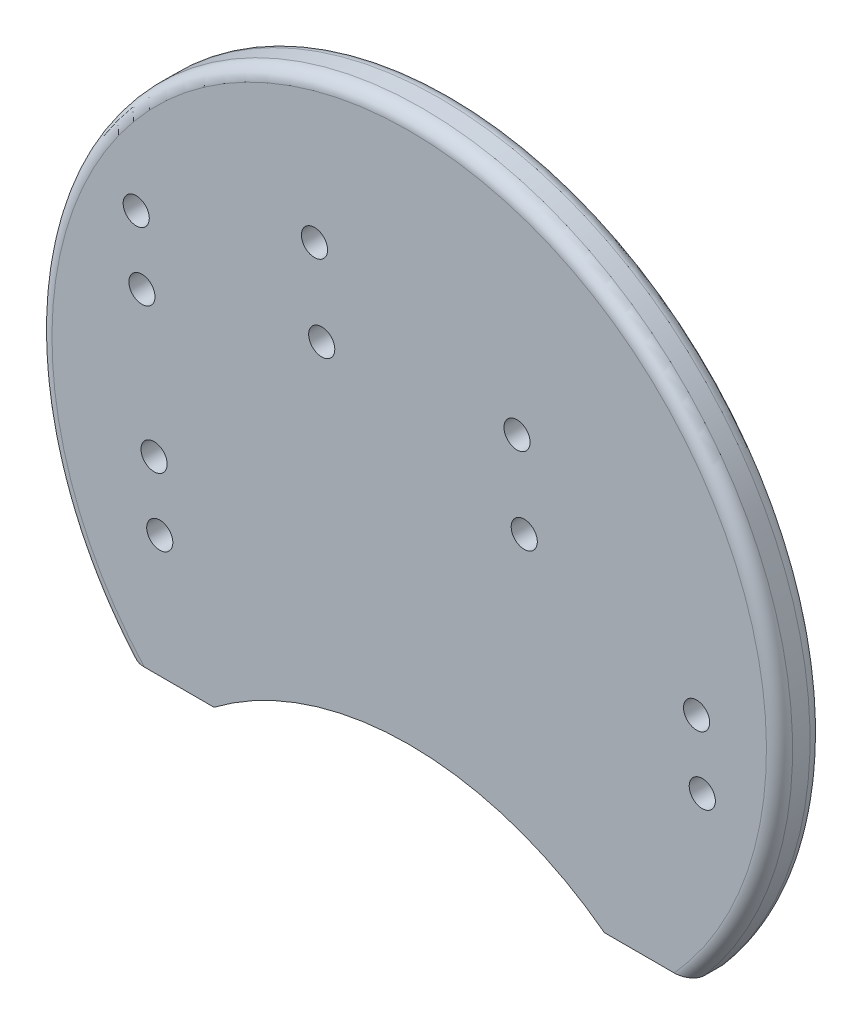
ISO-10303-21;
HEADER;
FILE_DESCRIPTION(('STEP AP214'),'2;1');
FILE_NAME('part.step','',(''),(''),'','','');
FILE_SCHEMA(('AUTOMOTIVE_DESIGN { 1 0 10303 214 1 1 1 1 }'));
ENDSEC;
DATA;
#1=APPLICATION_CONTEXT('core data for automotive mechanical design processes');
#2=APPLICATION_PROTOCOL_DEFINITION('international standard','automotive_design',2000,#1);
#3=PRODUCT_CONTEXT('',#1,'mechanical');
#4=PRODUCT('Part','Part','',(#3));
#5=PRODUCT_RELATED_PRODUCT_CATEGORY('part','',(#4));
#6=PRODUCT_DEFINITION_FORMATION('','',#4);
#7=PRODUCT_DEFINITION_CONTEXT('part definition',#1,'design');
#8=PRODUCT_DEFINITION('design','',#6,#7);
#9=PRODUCT_DEFINITION_SHAPE('','',#8);
#10=(LENGTH_UNIT() NAMED_UNIT(*) SI_UNIT(.MILLI.,.METRE.));
#11=(NAMED_UNIT(*) PLANE_ANGLE_UNIT() SI_UNIT($,.RADIAN.));
#12=(NAMED_UNIT(*) SI_UNIT($,.STERADIAN.) SOLID_ANGLE_UNIT());
#13=UNCERTAINTY_MEASURE_WITH_UNIT(LENGTH_MEASURE(1.E-05),#10,'distance_accuracy_value','');
#14=(GEOMETRIC_REPRESENTATION_CONTEXT(3) GLOBAL_UNCERTAINTY_ASSIGNED_CONTEXT((#13)) GLOBAL_UNIT_ASSIGNED_CONTEXT((#10,
#11,#12)) REPRESENTATION_CONTEXT('',''));
#15=CARTESIAN_POINT('',(0.,0.,0.));
#16=DIRECTION('',(0.,0.,1.));
#17=DIRECTION('',(1.,0.,0.));
#18=AXIS2_PLACEMENT_3D('',#15,#16,#17);
#19=CARTESIAN_POINT('',(0.,-55.,5.));
#20=DIRECTION('',(0.,1.,0.));
#21=DIRECTION('',(0.,0.,1.));
#22=AXIS2_PLACEMENT_3D('',#19,#20,#21);
#23=PLANE('',#22);
#24=DIRECTION('',(0.,0.,-1.));
#25=VECTOR('',#24,1.);
#26=CARTESIAN_POINT('',(-64.8074069840786,-55.,5.));
#27=LINE('',#26,#25);
#28=CARTESIAN_POINT('',(-64.8074069840786,-55.,2.));
#29=VERTEX_POINT('',#28);
#30=CARTESIAN_POINT('',(-64.8074069840786,-55.,-2.));
#31=VERTEX_POINT('',#30);
#32=EDGE_CURVE('E480',#29,#31,#27,.T.);
#33=ORIENTED_EDGE('',*,*,#32,.T.);
#34=CARTESIAN_POINT('',(-64.8074069840786,-55.,-2.));
#35=CARTESIAN_POINT('',(-64.8074268967705,-55.,-2.07017376600735));
#36=CARTESIAN_POINT('',(-64.8041782749097,-55.,-2.14033710693224));
#37=CARTESIAN_POINT('',(-64.7912969048283,-55.,-2.28003549121753));
#38=CARTESIAN_POINT('',(-64.7816678794978,-55.,-2.34957087701401));
#39=CARTESIAN_POINT('',(-64.7562656738383,-55.,-2.48701638397184));
#40=CARTESIAN_POINT('',(-64.7405350591641,-55.,-2.5549343782473));
#41=CARTESIAN_POINT('',(-64.7032139274096,-55.,-2.6891263449199));
#42=CARTESIAN_POINT('',(-64.6816228255037,-55.,-2.75540015252079));
#43=CARTESIAN_POINT('',(-64.6086455300426,-55.,-2.95080807041998));
#44=CARTESIAN_POINT('',(-64.548977326587,-55.,-3.07693641047113));
#45=CARTESIAN_POINT('',(-64.4107945092723,-55.,-3.31845581623571));
#46=CARTESIAN_POINT('',(-64.3322463569326,-55.,-3.43382726134954));
#47=CARTESIAN_POINT('',(-64.1313574653287,-55.,-3.68823422045039));
#48=CARTESIAN_POINT('',(-64.0031045756527,-55.,-3.82261073871501));
#49=CARTESIAN_POINT('',(-63.7264968928117,-55.,-4.06866596488717));
#50=CARTESIAN_POINT('',(-63.5781128018333,-55.,-4.18031098718611));
#51=CARTESIAN_POINT('',(-63.2195310796711,-55.,-4.4117890684866));
#52=CARTESIAN_POINT('',(-63.0042698098773,-55.,-4.52376284618862));
#53=CARTESIAN_POINT('',(-62.5584067039696,-55.,-4.71157532707385));
#54=CARTESIAN_POINT('',(-62.3277749227013,-55.,-4.78734099617894));
#55=CARTESIAN_POINT('',(-61.8842569297316,-55.,-4.89803431449409));
#56=CARTESIAN_POINT('',(-61.6722578687819,-55.,-4.93657240553139));
#57=CARTESIAN_POINT('',(-61.3527307579443,-55.,-4.97478533503295));
#58=CARTESIAN_POINT('',(-61.2462827635918,-55.,-4.98425789791074));
#59=CARTESIAN_POINT('',(-61.0330318632915,-55.,-4.99686090360605));
#60=CARTESIAN_POINT('',(-60.9262290310473,-55.,-4.99999258993944));
#61=CARTESIAN_POINT('',(-60.8194047981399,-55.,-5.));
#62=B_SPLINE_CURVE_WITH_KNOTS('',3,(#34,#35,#36,#37,#38,#39,#40,#41,#42,#43,#44,#45,#46,#47,#48,
#49,#50,#51,#52,#53,#54,#55,#56,#57,#58,#59,#60,#61),.UNSPECIFIED.,.F.,.F.,(4,2,2,2,2,2,2,2,2,2,
2,2,2,4),(0.,0.210429027441488,0.420735380019425,0.629600250271415,0.838485971085202,
1.25502836246098,1.67231624375148,2.22654422332247,2.7815876248927,3.50564901932298,
4.23116479141808,4.87581766073226,5.19626167146708,5.51664283350574),.UNSPECIFIED.);
#63=CARTESIAN_POINT('',(-60.8194047981399,-55.,-5.));
#64=VERTEX_POINT('',#63);
#65=EDGE_CURVE('E126',#31,#64,#62,.T.);
#66=ORIENTED_EDGE('',*,*,#65,.T.);
#67=DIRECTION('',(1.,0.,0.));
#68=VECTOR('',#67,1.);
#69=CARTESIAN_POINT('',(0.,-55.,-5.));
#70=LINE('',#69,#68);
#71=CARTESIAN_POINT('',(-44.8074069840786,-55.,-5.));
#72=VERTEX_POINT('',#71);
#73=EDGE_CURVE('E108',#64,#72,#70,.T.);
#74=ORIENTED_EDGE('',*,*,#73,.T.);
#75=DIRECTION('',(0.,0.,-1.));
#76=VECTOR('',#75,1.);
#77=CARTESIAN_POINT('',(-44.8074069840786,-55.,5.));
#78=LINE('',#77,#76);
#79=CARTESIAN_POINT('',(-44.8074069840786,-55.,5.));
#80=VERTEX_POINT('',#79);
#81=EDGE_CURVE('E103',#80,#72,#78,.T.);
#82=ORIENTED_EDGE('',*,*,#81,.F.);
#83=DIRECTION('',(1.,0.,0.));
#84=VECTOR('',#83,1.);
#85=CARTESIAN_POINT('',(0.,-55.,5.));
#86=LINE('',#85,#84);
#87=CARTESIAN_POINT('',(-60.8194047981399,-55.,5.));
#88=VERTEX_POINT('',#87);
#89=EDGE_CURVE('E89',#88,#80,#86,.T.);
#90=ORIENTED_EDGE('',*,*,#89,.F.);
#91=CARTESIAN_POINT('',(-60.8194047981399,-55.,5.));
#92=CARTESIAN_POINT('',(-60.945625863291,-55.,4.9999889830993));
#93=CARTESIAN_POINT('',(-61.0718569660454,-55.,4.99561690403786));
#94=CARTESIAN_POINT('',(-61.3237732751623,-55.,4.97799378576039));
#95=CARTESIAN_POINT('',(-61.4494580997143,-55.,4.96473730864916));
#96=CARTESIAN_POINT('',(-61.7004767965694,-55.,4.92905783526543));
#97=CARTESIAN_POINT('',(-61.8258013342802,-55.,4.90656832302142));
#98=CARTESIAN_POINT('',(-62.0743501967901,-55.,4.85221082256843));
#99=CARTESIAN_POINT('',(-62.1975749963845,-55.,4.82034498513398));
#100=CARTESIAN_POINT('',(-62.539268149121,-55.,4.71739649343896));
#101=CARTESIAN_POINT('',(-62.7545881924577,-55.,4.63539025117179));
#102=CARTESIAN_POINT('',(-63.1691063414027,-55.,4.43827338300853));
#103=CARTESIAN_POINT('',(-63.3683463405692,-55.,4.32325258879546));
#104=CARTESIAN_POINT('',(-63.6991563705766,-55.,4.08927516319722));
#105=CARTESIAN_POINT('',(-63.8357142927849,-55.,3.97739386975744));
#106=CARTESIAN_POINT('',(-64.0892080563743,-55.,3.73310610133389));
#107=CARTESIAN_POINT('',(-64.2061618144301,-55.,3.60071858274834));
#108=CARTESIAN_POINT('',(-64.3955183334329,-55.,3.34212397341914));
#109=CARTESIAN_POINT('',(-64.4721462599327,-55.,3.21902056561151));
#110=CARTESIAN_POINT('',(-64.6039082276278,-55.,2.96192492413344));
#111=CARTESIAN_POINT('',(-64.6590829514737,-55.,2.8279538883949));
#112=CARTESIAN_POINT('',(-64.7363942816099,-55.,2.57876379357256));
#113=CARTESIAN_POINT('',(-64.7628410860461,-55.,2.46488538358608));
#114=CARTESIAN_POINT('',(-64.789483142185,-55.,2.29189886971727));
#115=CARTESIAN_POINT('',(-64.7961927741762,-55.,2.23374310426697));
#116=CARTESIAN_POINT('',(-64.8051584437399,-55.,2.11706518304516));
#117=CARTESIAN_POINT('',(-64.8074126099015,-55.,2.0585428836685));
#118=CARTESIAN_POINT('',(-64.8074069840786,-55.,2.));
#119=B_SPLINE_CURVE_WITH_KNOTS('',3,(#91,#92,#93,#94,#95,#96,#97,#98,#99,#100,#101,#102,#103,
#104,#105,#106,#107,#108,#109,#110,#111,#112,#113,#114,#115,#116,#117,#118),.UNSPECIFIED.,.F.,
.F.,(4,2,2,2,2,2,2,2,2,2,2,2,2,4),(0.,0.378601650665155,0.75743524485891,1.13904727867092,
1.52057184511905,2.20910017277166,2.89577251110227,3.42348058154642,3.95070370696318,
4.38396232877499,4.81639528876439,5.16577043775966,5.34124228356202,5.51678781642666),.UNSPECIFIED.);
#120=EDGE_CURVE('E120',#88,#29,#119,.T.);
#121=ORIENTED_EDGE('',*,*,#120,.T.);
#122=EDGE_LOOP('',(#33,#66,#74,#82,#90,#121));
#123=FACE_BOUND('',#122,.T.);
#124=ADVANCED_FACE('F32',(#123),#23,.F.);
#125=CARTESIAN_POINT('',(0.,-114.423457354562,5.));
#126=DIRECTION('',(0.,0.,-1.));
#127=DIRECTION('',(-1.,0.,0.));
#128=AXIS2_PLACEMENT_3D('',#125,#126,#127);
#129=CYLINDRICAL_SURFACE('',#128,74.4234573545618);
#130=CARTESIAN_POINT('',(0.,-114.423457354562,-5.));
#131=DIRECTION('',(0.,0.,1.));
#132=DIRECTION('',(1.,0.,0.));
#133=AXIS2_PLACEMENT_3D('',#130,#131,#132);
#134=CIRCLE('',#133,74.4234573545618);
#135=CARTESIAN_POINT('',(44.8074069840786,-55.,-5.));
#136=VERTEX_POINT('',#135);
#137=EDGE_CURVE('E478',#72,#136,#134,.F.);
#138=ORIENTED_EDGE('',*,*,#137,.T.);
#139=DIRECTION('',(0.,0.,-1.));
#140=VECTOR('',#139,1.);
#141=CARTESIAN_POINT('',(44.8074069840786,-55.,5.));
#142=LINE('',#141,#140);
#143=CARTESIAN_POINT('',(44.8074069840786,-55.,5.));
#144=VERTEX_POINT('',#143);
#145=EDGE_CURVE('E105',#144,#136,#142,.T.);
#146=ORIENTED_EDGE('',*,*,#145,.F.);
#147=CARTESIAN_POINT('',(0.,-114.423457354562,5.));
#148=DIRECTION('',(0.,0.,1.));
#149=DIRECTION('',(1.,0.,0.));
#150=AXIS2_PLACEMENT_3D('',#147,#148,#149);
#151=CIRCLE('',#150,74.4234573545618);
#152=EDGE_CURVE('E92',#80,#144,#151,.F.);
#153=ORIENTED_EDGE('',*,*,#152,.F.);
#154=ORIENTED_EDGE('',*,*,#81,.T.);
#155=EDGE_LOOP('',(#138,#146,#153,#154));
#156=FACE_BOUND('',#155,.T.);
#157=ADVANCED_FACE('F102',(#156),#129,.F.);
#158=CARTESIAN_POINT('',(60.8194047981399,-55.,-5.));
#159=VERTEX_POINT('',#158);
#160=EDGE_CURVE('E97',#136,#159,#70,.T.);
#161=ORIENTED_EDGE('',*,*,#160,.T.);
#162=CARTESIAN_POINT('',(60.8194047981399,-55.,-5.));
#163=CARTESIAN_POINT('',(60.945625863291,-55.,-4.9999889830993));
#164=CARTESIAN_POINT('',(61.0718569660454,-55.,-4.99561690403786));
#165=CARTESIAN_POINT('',(61.3237732751623,-55.,-4.97799378576039));
#166=CARTESIAN_POINT('',(61.4494580997143,-55.,-4.96473730864916));
#167=CARTESIAN_POINT('',(61.7004767965694,-55.,-4.92905783526543));
#168=CARTESIAN_POINT('',(61.8258013342802,-55.,-4.90656832302142));
#169=CARTESIAN_POINT('',(62.0743501967901,-55.,-4.85221082256843));
#170=CARTESIAN_POINT('',(62.1975749963845,-55.,-4.82034498513398));
#171=CARTESIAN_POINT('',(62.539268149121,-55.,-4.71739649343896));
#172=CARTESIAN_POINT('',(62.7545881924577,-55.,-4.63539025117179));
#173=CARTESIAN_POINT('',(63.1691063414027,-55.,-4.43827338300853));
#174=CARTESIAN_POINT('',(63.3683463405692,-55.,-4.32325258879546));
#175=CARTESIAN_POINT('',(63.6991563705766,-55.,-4.08927516319722));
#176=CARTESIAN_POINT('',(63.8357142927849,-55.,-3.97739386975744));
#177=CARTESIAN_POINT('',(64.0892080563743,-55.,-3.73310610133389));
#178=CARTESIAN_POINT('',(64.2061618144301,-55.,-3.60071858274834));
#179=CARTESIAN_POINT('',(64.3955183334329,-55.,-3.34212397341914));
#180=CARTESIAN_POINT('',(64.4721462599327,-55.,-3.21902056561151));
#181=CARTESIAN_POINT('',(64.6039082276278,-55.,-2.96192492413344));
#182=CARTESIAN_POINT('',(64.6590829514737,-55.,-2.8279538883949));
#183=CARTESIAN_POINT('',(64.7363942816099,-55.,-2.57876379357256));
#184=CARTESIAN_POINT('',(64.7628410860461,-55.,-2.46488538358608));
#185=CARTESIAN_POINT('',(64.789483142185,-55.,-2.29189886971727));
#186=CARTESIAN_POINT('',(64.7961927741762,-55.,-2.23374310426697));
#187=CARTESIAN_POINT('',(64.8051584437399,-55.,-2.11706518304516));
#188=CARTESIAN_POINT('',(64.8074126099015,-55.,-2.0585428836685));
#189=CARTESIAN_POINT('',(64.8074069840786,-55.,-2.));
#190=B_SPLINE_CURVE_WITH_KNOTS('',3,(#162,#163,#164,#165,#166,#167,#168,#169,#170,#171,#172,
#173,#174,#175,#176,#177,#178,#179,#180,#181,#182,#183,#184,#185,#186,#187,#188,#189),
.UNSPECIFIED.,.F.,.F.,(4,2,2,2,2,2,2,2,2,2,2,2,2,4),(0.,0.378601650665155,0.75743524485891,
1.13904727867092,1.52057184511905,2.20910017277166,2.89577251110227,3.42348058154642,
3.95070370696318,4.38396232877499,4.81639528876439,5.16577043775966,5.34124228356202,
5.51678781642666),.UNSPECIFIED.);
#191=CARTESIAN_POINT('',(64.8074069840786,-55.,-2.));
#192=VERTEX_POINT('',#191);
#193=EDGE_CURVE('E41',#159,#192,#190,.T.);
#194=ORIENTED_EDGE('',*,*,#193,.T.);
#195=DIRECTION('',(0.,0.,-1.));
#196=VECTOR('',#195,1.);
#197=CARTESIAN_POINT('',(64.8074069840786,-55.,5.));
#198=LINE('',#197,#196);
#199=CARTESIAN_POINT('',(64.8074069840786,-55.,2.));
#200=VERTEX_POINT('',#199);
#201=EDGE_CURVE('E114',#200,#192,#198,.T.);
#202=ORIENTED_EDGE('',*,*,#201,.F.);
#203=CARTESIAN_POINT('',(64.8074069840786,-55.,2.));
#204=CARTESIAN_POINT('',(64.8074268967705,-55.,2.07017376600735));
#205=CARTESIAN_POINT('',(64.8041782749097,-55.,2.14033710693224));
#206=CARTESIAN_POINT('',(64.7912969048283,-55.,2.28003549121753));
#207=CARTESIAN_POINT('',(64.7816678794978,-55.,2.34957087701401));
#208=CARTESIAN_POINT('',(64.7562656738383,-55.,2.48701638397184));
#209=CARTESIAN_POINT('',(64.7405350591641,-55.,2.5549343782473));
#210=CARTESIAN_POINT('',(64.7032139274096,-55.,2.6891263449199));
#211=CARTESIAN_POINT('',(64.6816228255037,-55.,2.75540015252079));
#212=CARTESIAN_POINT('',(64.6086455300426,-55.,2.95080807041998));
#213=CARTESIAN_POINT('',(64.548977326587,-55.,3.07693641047113));
#214=CARTESIAN_POINT('',(64.4107945092723,-55.,3.31845581623571));
#215=CARTESIAN_POINT('',(64.3322463569326,-55.,3.43382726134954));
#216=CARTESIAN_POINT('',(64.1313574653287,-55.,3.68823422045039));
#217=CARTESIAN_POINT('',(64.0031045756527,-55.,3.82261073871501));
#218=CARTESIAN_POINT('',(63.7264968928117,-55.,4.06866596488717));
#219=CARTESIAN_POINT('',(63.5781128018333,-55.,4.18031098718611));
#220=CARTESIAN_POINT('',(63.2195310796711,-55.,4.4117890684866));
#221=CARTESIAN_POINT('',(63.0042698098773,-55.,4.52376284618862));
#222=CARTESIAN_POINT('',(62.5584067039696,-55.,4.71157532707385));
#223=CARTESIAN_POINT('',(62.3277749227013,-55.,4.78734099617894));
#224=CARTESIAN_POINT('',(61.8842569297316,-55.,4.89803431449409));
#225=CARTESIAN_POINT('',(61.6722578687819,-55.,4.93657240553139));
#226=CARTESIAN_POINT('',(61.3527307579443,-55.,4.97478533503295));
#227=CARTESIAN_POINT('',(61.2462827635918,-55.,4.98425789791074));
#228=CARTESIAN_POINT('',(61.0330318632915,-55.,4.99686090360605));
#229=CARTESIAN_POINT('',(60.9262290310473,-55.,4.99999258993944));
#230=CARTESIAN_POINT('',(60.8194047981399,-55.,5.));
#231=B_SPLINE_CURVE_WITH_KNOTS('',3,(#203,#204,#205,#206,#207,#208,#209,#210,#211,#212,#213,
#214,#215,#216,#217,#218,#219,#220,#221,#222,#223,#224,#225,#226,#227,#228,#229,#230),
.UNSPECIFIED.,.F.,.F.,(4,2,2,2,2,2,2,2,2,2,2,2,2,4),(0.,0.210429027441488,0.420735380019425,
0.629600250271415,0.838485971085202,1.25502836246098,1.67231624375148,2.22654422332247,
2.7815876248927,3.50564901932298,4.23116479141808,4.87581766073226,5.19626167146708,
5.51664283350574),.UNSPECIFIED.);
#232=CARTESIAN_POINT('',(60.8194047981399,-55.,5.));
#233=VERTEX_POINT('',#232);
#234=EDGE_CURVE('E48',#200,#233,#231,.T.);
#235=ORIENTED_EDGE('',*,*,#234,.T.);
#236=EDGE_CURVE('E99',#144,#233,#86,.T.);
#237=ORIENTED_EDGE('',*,*,#236,.F.);
#238=ORIENTED_EDGE('',*,*,#145,.T.);
#239=EDGE_LOOP('',(#161,#194,#202,#235,#237,#238));
#240=FACE_BOUND('',#239,.T.);
#241=ADVANCED_FACE('F131',(#240),#23,.F.);
#242=CARTESIAN_POINT('',(0.,0.,5.));
#243=DIRECTION('',(0.,0.,-1.));
#244=DIRECTION('',(-1.,0.,0.));
#245=AXIS2_PLACEMENT_3D('',#242,#243,#244);
#246=CYLINDRICAL_SURFACE('',#245,85.);
#247=ORIENTED_EDGE('',*,*,#201,.T.);
#248=CARTESIAN_POINT('',(0.,0.,-2.));
#249=DIRECTION('',(0.,0.,1.));
#250=DIRECTION('',(1.,0.,0.));
#251=AXIS2_PLACEMENT_3D('',#248,#249,#250);
#252=CIRCLE('',#251,85.);
#253=EDGE_CURVE('E112',#192,#31,#252,.T.);
#254=ORIENTED_EDGE('',*,*,#253,.T.);
#255=ORIENTED_EDGE('',*,*,#32,.F.);
#256=CARTESIAN_POINT('',(0.,0.,2.));
#257=DIRECTION('',(0.,0.,1.));
#258=DIRECTION('',(1.,0.,0.));
#259=AXIS2_PLACEMENT_3D('',#256,#257,#258);
#260=CIRCLE('',#259,85.);
#261=EDGE_CURVE('E110',#29,#200,#260,.F.);
#262=ORIENTED_EDGE('',*,*,#261,.T.);
#263=EDGE_LOOP('',(#247,#254,#255,#262));
#264=FACE_BOUND('',#263,.T.);
#265=ADVANCED_FACE('F136',(#264),#246,.T.);
#266=CARTESIAN_POINT('',(0.,-187.141421356237,5.));
#267=DIRECTION('',(0.,0.,1.));
#268=DIRECTION('',(1.,0.,0.));
#269=AXIS2_PLACEMENT_3D('',#266,#267,#268);
#270=PLANE('',#269);
#271=CARTESIAN_POINT('',(67.2672476986638,-16.1055321565431,5.));
#272=DIRECTION('',(0.,0.,1.));
#273=DIRECTION('',(1.,0.,0.));
#274=AXIS2_PLACEMENT_3D('',#271,#272,#273);
#275=CIRCLE('',#274,2.99999999999999);
#276=CARTESIAN_POINT('',(70.2672476986638,-16.1055321565431,5.));
#277=VERTEX_POINT('',#276);
#278=EDGE_CURVE('E419',#277,#277,#275,.T.);
#279=ORIENTED_EDGE('',*,*,#278,.F.);
#280=EDGE_LOOP('',(#279));
#281=FACE_BOUND('',#280,.T.);
#282=CARTESIAN_POINT('',(65.959911557449,-1.16261168516696,5.));
#283=DIRECTION('',(0.,0.,1.));
#284=DIRECTION('',(1.,0.,0.));
#285=AXIS2_PLACEMENT_3D('',#282,#283,#284);
#286=CIRCLE('',#285,2.99999999999999);
#287=CARTESIAN_POINT('',(68.959911557449,-1.16261168516696,5.));
#288=VERTEX_POINT('',#287);
#289=EDGE_CURVE('E421',#288,#288,#286,.T.);
#290=ORIENTED_EDGE('',*,*,#289,.F.);
#291=EDGE_LOOP('',(#290));
#292=FACE_BOUND('',#291,.T.);
#293=CARTESIAN_POINT('',(26.4007124353781,15.,5.));
#294=DIRECTION('',(0.,0.,1.));
#295=DIRECTION('',(1.,0.,0.));
#296=AXIS2_PLACEMENT_3D('',#293,#294,#295);
#297=CIRCLE('',#296,2.99999999999999);
#298=CARTESIAN_POINT('',(29.4007124353781,15.,5.));
#299=VERTEX_POINT('',#298);
#300=EDGE_CURVE('E427',#299,#299,#297,.T.);
#301=ORIENTED_EDGE('',*,*,#300,.F.);
#302=EDGE_LOOP('',(#301));
#303=FACE_BOUND('',#302,.T.);
#304=CARTESIAN_POINT('',(24.7447533231727,33.9276992637432,5.));
#305=DIRECTION('',(0.,0.,1.));
#306=DIRECTION('',(1.,0.,0.));
#307=AXIS2_PLACEMENT_3D('',#304,#305,#306);
#308=CIRCLE('',#307,2.99999999999999);
#309=CARTESIAN_POINT('',(27.7447533231727,33.9276992637432,5.));
#310=VERTEX_POINT('',#309);
#311=EDGE_CURVE('E433',#310,#310,#308,.T.);
#312=ORIENTED_EDGE('',*,*,#311,.F.);
#313=EDGE_LOOP('',(#312));
#314=FACE_BOUND('',#313,.T.);
#315=CARTESIAN_POINT('',(-20.0835102069613,30.,5.));
#316=DIRECTION('',(0.,0.,1.));
#317=DIRECTION('',(1.,0.,0.));
#318=AXIS2_PLACEMENT_3D('',#315,#316,#317);
#319=CIRCLE('',#318,3.00000000000001);
#320=CARTESIAN_POINT('',(-17.0835102069613,30.,5.));
#321=VERTEX_POINT('',#320);
#322=EDGE_CURVE('E439',#321,#321,#319,.T.);
#323=ORIENTED_EDGE('',*,*,#322,.F.);
#324=EDGE_LOOP('',(#323));
#325=FACE_BOUND('',#324,.T.);
#326=CARTESIAN_POINT('',(-21.7394693191667,48.9276992637432,5.));
#327=DIRECTION('',(0.,0.,1.));
#328=DIRECTION('',(1.,0.,0.));
#329=AXIS2_PLACEMENT_3D('',#326,#327,#328);
#330=CIRCLE('',#329,3.00000000000001);
#331=CARTESIAN_POINT('',(-18.7394693191667,48.9276992637432,5.));
#332=VERTEX_POINT('',#331);
#333=EDGE_CURVE('E445',#332,#332,#330,.T.);
#334=ORIENTED_EDGE('',*,*,#333,.F.);
#335=EDGE_LOOP('',(#334));
#336=FACE_BOUND('',#335,.T.);
#337=CARTESIAN_POINT('',(-62.660745613159,34.7640712816882,5.));
#338=DIRECTION('',(0.,0.,1.));
#339=DIRECTION('',(1.,0.,0.));
#340=AXIS2_PLACEMENT_3D('',#337,#338,#339);
#341=CIRCLE('',#340,3.00000000000002);
#342=CARTESIAN_POINT('',(-59.660745613159,34.7640712816882,5.));
#343=VERTEX_POINT('',#342);
#344=EDGE_CURVE('E451',#343,#343,#341,.T.);
#345=ORIENTED_EDGE('',*,*,#344,.F.);
#346=EDGE_LOOP('',(#345));
#347=FACE_BOUND('',#346,.T.);
#348=CARTESIAN_POINT('',(-61.3534094719442,19.821150810312,5.));
#349=DIRECTION('',(0.,0.,1.));
#350=DIRECTION('',(1.,0.,0.));
#351=AXIS2_PLACEMENT_3D('',#348,#349,#350);
#352=CIRCLE('',#351,3.00000000000001);
#353=CARTESIAN_POINT('',(-58.3534094719442,19.821150810312,5.));
#354=VERTEX_POINT('',#353);
#355=EDGE_CURVE('E457',#354,#354,#352,.T.);
#356=ORIENTED_EDGE('',*,*,#355,.F.);
#357=EDGE_LOOP('',(#356));
#358=FACE_BOUND('',#357,.T.);
#359=CARTESIAN_POINT('',(-58.5644257040192,-12.0570795286238,5.));
#360=DIRECTION('',(0.,0.,1.));
#361=DIRECTION('',(1.,0.,0.));
#362=AXIS2_PLACEMENT_3D('',#359,#360,#361);
#363=CIRCLE('',#362,3.);
#364=CARTESIAN_POINT('',(-55.5644257040192,-12.0570795286238,5.));
#365=VERTEX_POINT('',#364);
#366=EDGE_CURVE('E463',#365,#365,#363,.T.);
#367=ORIENTED_EDGE('',*,*,#366,.F.);
#368=EDGE_LOOP('',(#367));
#369=FACE_BOUND('',#368,.T.);
#370=CARTESIAN_POINT('',(-57.2570895628044,-27.,5.));
#371=DIRECTION('',(0.,0.,1.));
#372=DIRECTION('',(1.,0.,0.));
#373=AXIS2_PLACEMENT_3D('',#370,#371,#372);
#374=CIRCLE('',#373,3.);
#375=CARTESIAN_POINT('',(-54.2570895628044,-27.,5.));
#376=VERTEX_POINT('',#375);
#377=EDGE_CURVE('E469',#376,#376,#374,.T.);
#378=ORIENTED_EDGE('',*,*,#377,.F.);
#379=EDGE_LOOP('',(#378));
#380=FACE_BOUND('',#379,.T.);
#381=ORIENTED_EDGE('',*,*,#236,.T.);
#382=CARTESIAN_POINT('',(0.,0.,5.));
#383=DIRECTION('',(0.,0.,1.));
#384=DIRECTION('',(1.,0.,0.));
#385=AXIS2_PLACEMENT_3D('',#382,#383,#384);
#386=CIRCLE('',#385,82.);
#387=EDGE_CURVE('E11',#233,#88,#386,.T.);
#388=ORIENTED_EDGE('',*,*,#387,.T.);
#389=ORIENTED_EDGE('',*,*,#89,.T.);
#390=ORIENTED_EDGE('',*,*,#152,.T.);
#391=EDGE_LOOP('',(#381,#388,#389,#390));
#392=FACE_BOUND('',#391,.T.);
#393=ADVANCED_FACE('F91',(#281,#292,#303,#314,#325,#336,#347,#358,#369,#380,#392),#270,.T.);
#394=CARTESIAN_POINT('',(0.,-187.141421356237,-5.));
#395=DIRECTION('',(0.,0.,1.));
#396=DIRECTION('',(1.,0.,0.));
#397=AXIS2_PLACEMENT_3D('',#394,#395,#396);
#398=PLANE('',#397);
#399=ORIENTED_EDGE('',*,*,#73,.F.);
#400=CARTESIAN_POINT('',(0.,0.,-5.));
#401=DIRECTION('',(0.,0.,1.));
#402=DIRECTION('',(1.,0.,0.));
#403=AXIS2_PLACEMENT_3D('',#400,#401,#402);
#404=CIRCLE('',#403,82.);
#405=EDGE_CURVE('E56',#64,#159,#404,.F.);
#406=ORIENTED_EDGE('',*,*,#405,.T.);
#407=ORIENTED_EDGE('',*,*,#160,.F.);
#408=ORIENTED_EDGE('',*,*,#137,.F.);
#409=EDGE_LOOP('',(#399,#406,#407,#408));
#410=FACE_BOUND('',#409,.T.);
#411=ADVANCED_FACE('F186',(#410),#398,.F.);
#412=CARTESIAN_POINT('',(-57.2570895628044,-27.,0.));
#413=DIRECTION('',(0.,0.,1.));
#414=DIRECTION('',(1.,0.,0.));
#415=AXIS2_PLACEMENT_3D('',#412,#413,#414);
#416=CYLINDRICAL_SURFACE('',#415,3.);
#417=CARTESIAN_POINT('',(-57.2570895628044,-27.,0.));
#418=DIRECTION('',(0.,0.,1.));
#419=DIRECTION('',(1.,0.,0.));
#420=AXIS2_PLACEMENT_3D('',#417,#418,#419);
#421=CIRCLE('',#420,3.);
#422=CARTESIAN_POINT('',(-54.2570895628044,-27.,0.));
#423=VERTEX_POINT('',#422);
#424=EDGE_CURVE('E472',#423,#423,#421,.T.);
#425=ORIENTED_EDGE('',*,*,#424,.F.);
#426=EDGE_LOOP('',(#425));
#427=FACE_BOUND('',#426,.T.);
#428=ORIENTED_EDGE('',*,*,#377,.T.);
#429=EDGE_LOOP('',(#428));
#430=FACE_BOUND('',#429,.T.);
#431=ADVANCED_FACE('F194',(#427,#430),#416,.F.);
#432=CARTESIAN_POINT('',(-57.2570895628044,-27.,0.));
#433=DIRECTION('',(0.,0.,1.));
#434=DIRECTION('',(1.,0.,0.));
#435=AXIS2_PLACEMENT_3D('',#432,#433,#434);
#436=PLANE('',#435);
#437=ORIENTED_EDGE('',*,*,#424,.T.);
#438=EDGE_LOOP('',(#437));
#439=FACE_BOUND('',#438,.T.);
#440=ADVANCED_FACE('F199',(#439),#436,.T.);
#441=CARTESIAN_POINT('',(-58.5644257040192,-12.0570795286238,0.));
#442=DIRECTION('',(0.,0.,1.));
#443=DIRECTION('',(1.,0.,0.));
#444=AXIS2_PLACEMENT_3D('',#441,#442,#443);
#445=CYLINDRICAL_SURFACE('',#444,3.);
#446=CARTESIAN_POINT('',(-58.5644257040192,-12.0570795286238,0.));
#447=DIRECTION('',(0.,0.,1.));
#448=DIRECTION('',(1.,0.,0.));
#449=AXIS2_PLACEMENT_3D('',#446,#447,#448);
#450=CIRCLE('',#449,3.);
#451=CARTESIAN_POINT('',(-55.5644257040192,-12.0570795286238,0.));
#452=VERTEX_POINT('',#451);
#453=EDGE_CURVE('E466',#452,#452,#450,.T.);
#454=ORIENTED_EDGE('',*,*,#453,.F.);
#455=EDGE_LOOP('',(#454));
#456=FACE_BOUND('',#455,.T.);
#457=ORIENTED_EDGE('',*,*,#366,.T.);
#458=EDGE_LOOP('',(#457));
#459=FACE_BOUND('',#458,.T.);
#460=ADVANCED_FACE('F207',(#456,#459),#445,.F.);
#461=CARTESIAN_POINT('',(-58.5644257040192,-12.0570795286238,0.));
#462=DIRECTION('',(0.,0.,1.));
#463=DIRECTION('',(1.,0.,0.));
#464=AXIS2_PLACEMENT_3D('',#461,#462,#463);
#465=PLANE('',#464);
#466=ORIENTED_EDGE('',*,*,#453,.T.);
#467=EDGE_LOOP('',(#466));
#468=FACE_BOUND('',#467,.T.);
#469=ADVANCED_FACE('F215',(#468),#465,.T.);
#470=CARTESIAN_POINT('',(-61.3534094719442,19.821150810312,0.));
#471=DIRECTION('',(0.,0.,1.));
#472=DIRECTION('',(1.,0.,0.));
#473=AXIS2_PLACEMENT_3D('',#470,#471,#472);
#474=CYLINDRICAL_SURFACE('',#473,3.00000000000001);
#475=CARTESIAN_POINT('',(-61.3534094719442,19.821150810312,0.));
#476=DIRECTION('',(0.,0.,1.));
#477=DIRECTION('',(1.,0.,0.));
#478=AXIS2_PLACEMENT_3D('',#475,#476,#477);
#479=CIRCLE('',#478,3.00000000000001);
#480=CARTESIAN_POINT('',(-58.3534094719442,19.821150810312,0.));
#481=VERTEX_POINT('',#480);
#482=EDGE_CURVE('E460',#481,#481,#479,.T.);
#483=ORIENTED_EDGE('',*,*,#482,.F.);
#484=EDGE_LOOP('',(#483));
#485=FACE_BOUND('',#484,.T.);
#486=ORIENTED_EDGE('',*,*,#355,.T.);
#487=EDGE_LOOP('',(#486));
#488=FACE_BOUND('',#487,.T.);
#489=ADVANCED_FACE('F223',(#485,#488),#474,.F.);
#490=CARTESIAN_POINT('',(-61.3534094719442,19.821150810312,0.));
#491=DIRECTION('',(0.,0.,1.));
#492=DIRECTION('',(1.,0.,0.));
#493=AXIS2_PLACEMENT_3D('',#490,#491,#492);
#494=PLANE('',#493);
#495=ORIENTED_EDGE('',*,*,#482,.T.);
#496=EDGE_LOOP('',(#495));
#497=FACE_BOUND('',#496,.T.);
#498=ADVANCED_FACE('F231',(#497),#494,.T.);
#499=CARTESIAN_POINT('',(-62.660745613159,34.7640712816882,0.));
#500=DIRECTION('',(0.,0.,1.));
#501=DIRECTION('',(1.,0.,0.));
#502=AXIS2_PLACEMENT_3D('',#499,#500,#501);
#503=CYLINDRICAL_SURFACE('',#502,3.00000000000002);
#504=CARTESIAN_POINT('',(-62.660745613159,34.7640712816882,0.));
#505=DIRECTION('',(0.,0.,1.));
#506=DIRECTION('',(1.,0.,0.));
#507=AXIS2_PLACEMENT_3D('',#504,#505,#506);
#508=CIRCLE('',#507,3.00000000000002);
#509=CARTESIAN_POINT('',(-59.660745613159,34.7640712816882,0.));
#510=VERTEX_POINT('',#509);
#511=EDGE_CURVE('E454',#510,#510,#508,.T.);
#512=ORIENTED_EDGE('',*,*,#511,.F.);
#513=EDGE_LOOP('',(#512));
#514=FACE_BOUND('',#513,.T.);
#515=ORIENTED_EDGE('',*,*,#344,.T.);
#516=EDGE_LOOP('',(#515));
#517=FACE_BOUND('',#516,.T.);
#518=ADVANCED_FACE('F239',(#514,#517),#503,.F.);
#519=CARTESIAN_POINT('',(-62.660745613159,34.7640712816882,0.));
#520=DIRECTION('',(0.,0.,1.));
#521=DIRECTION('',(1.,0.,0.));
#522=AXIS2_PLACEMENT_3D('',#519,#520,#521);
#523=PLANE('',#522);
#524=ORIENTED_EDGE('',*,*,#511,.T.);
#525=EDGE_LOOP('',(#524));
#526=FACE_BOUND('',#525,.T.);
#527=ADVANCED_FACE('F247',(#526),#523,.T.);
#528=CARTESIAN_POINT('',(-21.7394693191667,48.9276992637432,0.));
#529=DIRECTION('',(0.,0.,1.));
#530=DIRECTION('',(1.,0.,0.));
#531=AXIS2_PLACEMENT_3D('',#528,#529,#530);
#532=CYLINDRICAL_SURFACE('',#531,3.00000000000001);
#533=CARTESIAN_POINT('',(-21.7394693191667,48.9276992637432,0.));
#534=DIRECTION('',(0.,0.,1.));
#535=DIRECTION('',(1.,0.,0.));
#536=AXIS2_PLACEMENT_3D('',#533,#534,#535);
#537=CIRCLE('',#536,3.00000000000001);
#538=CARTESIAN_POINT('',(-18.7394693191667,48.9276992637432,0.));
#539=VERTEX_POINT('',#538);
#540=EDGE_CURVE('E448',#539,#539,#537,.T.);
#541=ORIENTED_EDGE('',*,*,#540,.F.);
#542=EDGE_LOOP('',(#541));
#543=FACE_BOUND('',#542,.T.);
#544=ORIENTED_EDGE('',*,*,#333,.T.);
#545=EDGE_LOOP('',(#544));
#546=FACE_BOUND('',#545,.T.);
#547=ADVANCED_FACE('F255',(#543,#546),#532,.F.);
#548=CARTESIAN_POINT('',(-21.7394693191667,48.9276992637432,0.));
#549=DIRECTION('',(0.,0.,1.));
#550=DIRECTION('',(1.,0.,0.));
#551=AXIS2_PLACEMENT_3D('',#548,#549,#550);
#552=PLANE('',#551);
#553=ORIENTED_EDGE('',*,*,#540,.T.);
#554=EDGE_LOOP('',(#553));
#555=FACE_BOUND('',#554,.T.);
#556=ADVANCED_FACE('F263',(#555),#552,.T.);
#557=CARTESIAN_POINT('',(-20.0835102069613,30.,0.));
#558=DIRECTION('',(0.,0.,1.));
#559=DIRECTION('',(1.,0.,0.));
#560=AXIS2_PLACEMENT_3D('',#557,#558,#559);
#561=CYLINDRICAL_SURFACE('',#560,3.00000000000001);
#562=CARTESIAN_POINT('',(-20.0835102069613,30.,0.));
#563=DIRECTION('',(0.,0.,1.));
#564=DIRECTION('',(1.,0.,0.));
#565=AXIS2_PLACEMENT_3D('',#562,#563,#564);
#566=CIRCLE('',#565,3.00000000000001);
#567=CARTESIAN_POINT('',(-17.0835102069613,30.,0.));
#568=VERTEX_POINT('',#567);
#569=EDGE_CURVE('E442',#568,#568,#566,.T.);
#570=ORIENTED_EDGE('',*,*,#569,.F.);
#571=EDGE_LOOP('',(#570));
#572=FACE_BOUND('',#571,.T.);
#573=ORIENTED_EDGE('',*,*,#322,.T.);
#574=EDGE_LOOP('',(#573));
#575=FACE_BOUND('',#574,.T.);
#576=ADVANCED_FACE('F271',(#572,#575),#561,.F.);
#577=CARTESIAN_POINT('',(-20.0835102069613,30.,0.));
#578=DIRECTION('',(0.,0.,1.));
#579=DIRECTION('',(1.,0.,0.));
#580=AXIS2_PLACEMENT_3D('',#577,#578,#579);
#581=PLANE('',#580);
#582=ORIENTED_EDGE('',*,*,#569,.T.);
#583=EDGE_LOOP('',(#582));
#584=FACE_BOUND('',#583,.T.);
#585=ADVANCED_FACE('F279',(#584),#581,.T.);
#586=CARTESIAN_POINT('',(24.7447533231727,33.9276992637432,0.));
#587=DIRECTION('',(0.,0.,1.));
#588=DIRECTION('',(1.,0.,0.));
#589=AXIS2_PLACEMENT_3D('',#586,#587,#588);
#590=CYLINDRICAL_SURFACE('',#589,2.99999999999999);
#591=CARTESIAN_POINT('',(24.7447533231727,33.9276992637432,0.));
#592=DIRECTION('',(0.,0.,1.));
#593=DIRECTION('',(1.,0.,0.));
#594=AXIS2_PLACEMENT_3D('',#591,#592,#593);
#595=CIRCLE('',#594,2.99999999999999);
#596=CARTESIAN_POINT('',(27.7447533231727,33.9276992637432,0.));
#597=VERTEX_POINT('',#596);
#598=EDGE_CURVE('E436',#597,#597,#595,.T.);
#599=ORIENTED_EDGE('',*,*,#598,.F.);
#600=EDGE_LOOP('',(#599));
#601=FACE_BOUND('',#600,.T.);
#602=ORIENTED_EDGE('',*,*,#311,.T.);
#603=EDGE_LOOP('',(#602));
#604=FACE_BOUND('',#603,.T.);
#605=ADVANCED_FACE('F287',(#601,#604),#590,.F.);
#606=CARTESIAN_POINT('',(24.7447533231727,33.9276992637432,0.));
#607=DIRECTION('',(0.,0.,1.));
#608=DIRECTION('',(1.,0.,0.));
#609=AXIS2_PLACEMENT_3D('',#606,#607,#608);
#610=PLANE('',#609);
#611=ORIENTED_EDGE('',*,*,#598,.T.);
#612=EDGE_LOOP('',(#611));
#613=FACE_BOUND('',#612,.T.);
#614=ADVANCED_FACE('F295',(#613),#610,.T.);
#615=CARTESIAN_POINT('',(26.4007124353781,15.,0.));
#616=DIRECTION('',(0.,0.,1.));
#617=DIRECTION('',(1.,0.,0.));
#618=AXIS2_PLACEMENT_3D('',#615,#616,#617);
#619=CYLINDRICAL_SURFACE('',#618,2.99999999999999);
#620=CARTESIAN_POINT('',(26.4007124353781,15.,0.));
#621=DIRECTION('',(0.,0.,1.));
#622=DIRECTION('',(1.,0.,0.));
#623=AXIS2_PLACEMENT_3D('',#620,#621,#622);
#624=CIRCLE('',#623,2.99999999999999);
#625=CARTESIAN_POINT('',(29.4007124353781,15.,0.));
#626=VERTEX_POINT('',#625);
#627=EDGE_CURVE('E430',#626,#626,#624,.T.);
#628=ORIENTED_EDGE('',*,*,#627,.F.);
#629=EDGE_LOOP('',(#628));
#630=FACE_BOUND('',#629,.T.);
#631=ORIENTED_EDGE('',*,*,#300,.T.);
#632=EDGE_LOOP('',(#631));
#633=FACE_BOUND('',#632,.T.);
#634=ADVANCED_FACE('F303',(#630,#633),#619,.F.);
#635=CARTESIAN_POINT('',(26.4007124353781,15.,0.));
#636=DIRECTION('',(0.,0.,1.));
#637=DIRECTION('',(1.,0.,0.));
#638=AXIS2_PLACEMENT_3D('',#635,#636,#637);
#639=PLANE('',#638);
#640=ORIENTED_EDGE('',*,*,#627,.T.);
#641=EDGE_LOOP('',(#640));
#642=FACE_BOUND('',#641,.T.);
#643=ADVANCED_FACE('F311',(#642),#639,.T.);
#644=CARTESIAN_POINT('',(65.959911557449,-1.16261168516696,0.));
#645=DIRECTION('',(0.,0.,1.));
#646=DIRECTION('',(1.,0.,0.));
#647=AXIS2_PLACEMENT_3D('',#644,#645,#646);
#648=CYLINDRICAL_SURFACE('',#647,2.99999999999999);
#649=CARTESIAN_POINT('',(65.959911557449,-1.16261168516696,0.));
#650=DIRECTION('',(0.,0.,1.));
#651=DIRECTION('',(1.,0.,0.));
#652=AXIS2_PLACEMENT_3D('',#649,#650,#651);
#653=CIRCLE('',#652,2.99999999999999);
#654=CARTESIAN_POINT('',(68.959911557449,-1.16261168516696,0.));
#655=VERTEX_POINT('',#654);
#656=EDGE_CURVE('E424',#655,#655,#653,.T.);
#657=ORIENTED_EDGE('',*,*,#656,.F.);
#658=EDGE_LOOP('',(#657));
#659=FACE_BOUND('',#658,.T.);
#660=ORIENTED_EDGE('',*,*,#289,.T.);
#661=EDGE_LOOP('',(#660));
#662=FACE_BOUND('',#661,.T.);
#663=ADVANCED_FACE('F319',(#659,#662),#648,.F.);
#664=CARTESIAN_POINT('',(65.959911557449,-1.16261168516696,0.));
#665=DIRECTION('',(0.,0.,1.));
#666=DIRECTION('',(1.,0.,0.));
#667=AXIS2_PLACEMENT_3D('',#664,#665,#666);
#668=PLANE('',#667);
#669=ORIENTED_EDGE('',*,*,#656,.T.);
#670=EDGE_LOOP('',(#669));
#671=FACE_BOUND('',#670,.T.);
#672=ADVANCED_FACE('F327',(#671),#668,.T.);
#673=CARTESIAN_POINT('',(67.2672476986638,-16.1055321565431,0.));
#674=DIRECTION('',(0.,0.,1.));
#675=DIRECTION('',(1.,0.,0.));
#676=AXIS2_PLACEMENT_3D('',#673,#674,#675);
#677=CYLINDRICAL_SURFACE('',#676,2.99999999999999);
#678=CARTESIAN_POINT('',(67.2672476986638,-16.1055321565431,0.));
#679=DIRECTION('',(0.,0.,1.));
#680=DIRECTION('',(1.,0.,0.));
#681=AXIS2_PLACEMENT_3D('',#678,#679,#680);
#682=CIRCLE('',#681,2.99999999999999);
#683=CARTESIAN_POINT('',(70.2672476986638,-16.1055321565431,0.));
#684=VERTEX_POINT('',#683);
#685=EDGE_CURVE('E416',#684,#684,#682,.T.);
#686=ORIENTED_EDGE('',*,*,#685,.F.);
#687=EDGE_LOOP('',(#686));
#688=FACE_BOUND('',#687,.T.);
#689=ORIENTED_EDGE('',*,*,#278,.T.);
#690=EDGE_LOOP('',(#689));
#691=FACE_BOUND('',#690,.T.);
#692=ADVANCED_FACE('F159',(#688,#691),#677,.F.);
#693=CARTESIAN_POINT('',(67.2672476986638,-16.1055321565431,0.));
#694=DIRECTION('',(0.,0.,1.));
#695=DIRECTION('',(1.,0.,0.));
#696=AXIS2_PLACEMENT_3D('',#693,#694,#695);
#697=PLANE('',#696);
#698=ORIENTED_EDGE('',*,*,#685,.T.);
#699=EDGE_LOOP('',(#698));
#700=FACE_BOUND('',#699,.T.);
#701=ADVANCED_FACE('F151',(#700),#697,.T.);
#702=CARTESIAN_POINT('',(0.,0.,-2.));
#703=DIRECTION('',(0.,0.,1.));
#704=DIRECTION('',(1.,0.,0.));
#705=AXIS2_PLACEMENT_3D('',#702,#703,#704);
#706=TOROIDAL_SURFACE('',#705,82.,3.);
#707=ORIENTED_EDGE('',*,*,#193,.F.);
#708=ORIENTED_EDGE('',*,*,#405,.F.);
#709=ORIENTED_EDGE('',*,*,#65,.F.);
#710=ORIENTED_EDGE('',*,*,#253,.F.);
#711=EDGE_LOOP('',(#707,#708,#709,#710));
#712=FACE_BOUND('',#711,.T.);
#713=ADVANCED_FACE('F148',(#712),#706,.T.);
#714=CARTESIAN_POINT('',(0.,0.,2.));
#715=DIRECTION('',(0.,0.,1.));
#716=DIRECTION('',(1.,0.,0.));
#717=AXIS2_PLACEMENT_3D('',#714,#715,#716);
#718=TOROIDAL_SURFACE('',#717,82.,3.);
#719=ORIENTED_EDGE('',*,*,#234,.F.);
#720=ORIENTED_EDGE('',*,*,#261,.F.);
#721=ORIENTED_EDGE('',*,*,#120,.F.);
#722=ORIENTED_EDGE('',*,*,#387,.F.);
#723=EDGE_LOOP('',(#719,#720,#721,#722));
#724=FACE_BOUND('',#723,.T.);
#725=ADVANCED_FACE('F34',(#724),#718,.T.);
#726=CLOSED_SHELL('',(#124,#157,#241,#265,#393,#411,#431,#440,#460,#469,#489,#498,#518,#527,
#547,#556,#576,#585,#605,#614,#634,#643,#663,#672,#692,#701,#713,#725));
#727=MANIFOLD_SOLID_BREP('B2',#726);
#728=ADVANCED_BREP_SHAPE_REPRESENTATION('',(#18,#727),#14);
#729=SHAPE_DEFINITION_REPRESENTATION(#9,#728);
ENDSEC;
END-ISO-10303-21;
